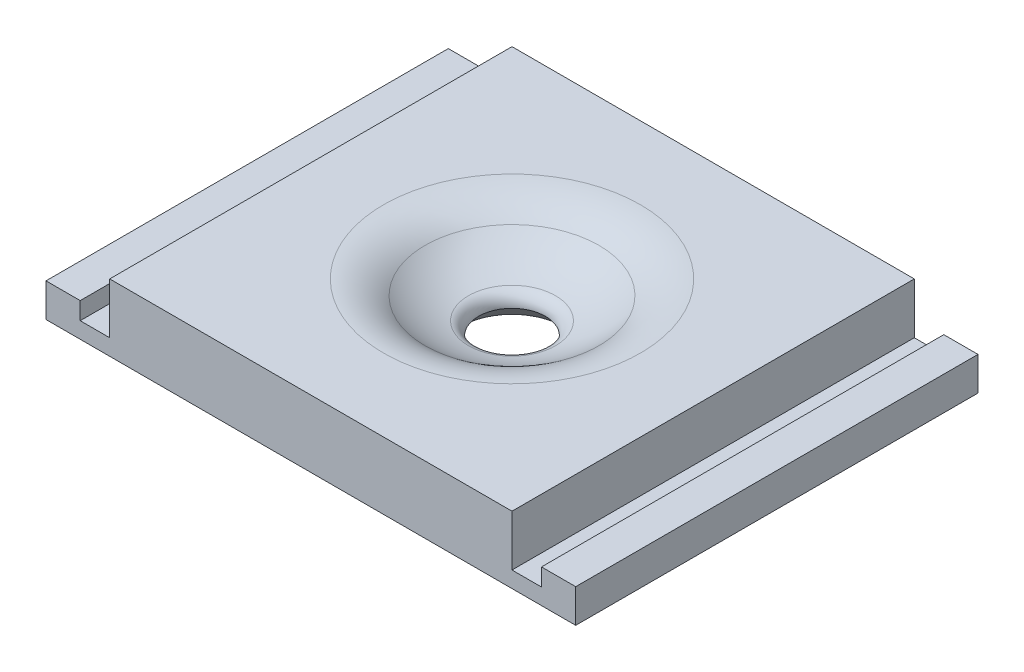
ISO-10303-21;
HEADER;
FILE_DESCRIPTION(('STEP AP214'),'2;1');
FILE_NAME('part.step','',(''),(''),'','','');
FILE_SCHEMA(('AUTOMOTIVE_DESIGN { 1 0 10303 214 1 1 1 1 }'));
ENDSEC;
DATA;
#1=APPLICATION_CONTEXT('core data for automotive mechanical design processes');
#2=APPLICATION_PROTOCOL_DEFINITION('international standard','automotive_design',2000,#1);
#3=PRODUCT_CONTEXT('',#1,'mechanical');
#4=PRODUCT('Part','Part','',(#3));
#5=PRODUCT_RELATED_PRODUCT_CATEGORY('part','',(#4));
#6=PRODUCT_DEFINITION_FORMATION('','',#4);
#7=PRODUCT_DEFINITION_CONTEXT('part definition',#1,'design');
#8=PRODUCT_DEFINITION('design','',#6,#7);
#9=PRODUCT_DEFINITION_SHAPE('','',#8);
#10=(LENGTH_UNIT() NAMED_UNIT(*) SI_UNIT(.MILLI.,.METRE.));
#11=(NAMED_UNIT(*) PLANE_ANGLE_UNIT() SI_UNIT($,.RADIAN.));
#12=(NAMED_UNIT(*) SI_UNIT($,.STERADIAN.) SOLID_ANGLE_UNIT());
#13=UNCERTAINTY_MEASURE_WITH_UNIT(LENGTH_MEASURE(1.E-05),#10,'distance_accuracy_value','');
#14=(GEOMETRIC_REPRESENTATION_CONTEXT(3) GLOBAL_UNCERTAINTY_ASSIGNED_CONTEXT((#13)) GLOBAL_UNIT_ASSIGNED_CONTEXT((#10,
#11,#12)) REPRESENTATION_CONTEXT('',''));
#15=CARTESIAN_POINT('',(0.,0.,0.));
#16=DIRECTION('',(0.,0.,1.));
#17=DIRECTION('',(1.,0.,0.));
#18=AXIS2_PLACEMENT_3D('',#15,#16,#17);
#19=CARTESIAN_POINT('',(-15.,11.,15.));
#20=DIRECTION('',(1.,0.,0.));
#21=DIRECTION('',(0.,0.,-1.));
#22=AXIS2_PLACEMENT_3D('',#19,#20,#21);
#23=PLANE('',#22);
#24=DIRECTION('',(0.,0.,-1.));
#25=VECTOR('',#24,1.);
#26=CARTESIAN_POINT('',(-15.,7.2,15.));
#27=LINE('',#26,#25);
#28=CARTESIAN_POINT('',(-15.,7.2,15.));
#29=VERTEX_POINT('',#28);
#30=CARTESIAN_POINT('',(-15.,7.2,-15.));
#31=VERTEX_POINT('',#30);
#32=EDGE_CURVE('E166',#29,#31,#27,.T.);
#33=ORIENTED_EDGE('',*,*,#32,.F.);
#34=DIRECTION('',(0.,-1.,0.));
#35=VECTOR('',#34,1.);
#36=CARTESIAN_POINT('',(-15.,11.,15.));
#37=LINE('',#36,#35);
#38=CARTESIAN_POINT('',(-15.,11.,15.));
#39=VERTEX_POINT('',#38);
#40=EDGE_CURVE('E215',#39,#29,#37,.T.);
#41=ORIENTED_EDGE('',*,*,#40,.F.);
#42=DIRECTION('',(0.,0.,1.));
#43=VECTOR('',#42,1.);
#44=CARTESIAN_POINT('',(-15.,11.,15.));
#45=LINE('',#44,#43);
#46=CARTESIAN_POINT('',(-15.,11.,-15.));
#47=VERTEX_POINT('',#46);
#48=EDGE_CURVE('E208',#47,#39,#45,.T.);
#49=ORIENTED_EDGE('',*,*,#48,.F.);
#50=DIRECTION('',(0.,-1.,0.));
#51=VECTOR('',#50,1.);
#52=CARTESIAN_POINT('',(-15.,11.,-15.));
#53=LINE('',#52,#51);
#54=EDGE_CURVE('E218',#47,#31,#53,.T.);
#55=ORIENTED_EDGE('',*,*,#54,.T.);
#56=EDGE_LOOP('',(#33,#41,#49,#55));
#57=FACE_BOUND('',#56,.T.);
#58=ADVANCED_FACE('F39',(#57),#23,.F.);
#59=CARTESIAN_POINT('',(15.,11.,15.));
#60=DIRECTION('',(-1.,0.,0.));
#61=DIRECTION('',(0.,0.,1.));
#62=AXIS2_PLACEMENT_3D('',#59,#60,#61);
#63=PLANE('',#62);
#64=DIRECTION('',(0.,-1.,0.));
#65=VECTOR('',#64,1.);
#66=CARTESIAN_POINT('',(15.,11.,15.));
#67=LINE('',#66,#65);
#68=CARTESIAN_POINT('',(15.,11.,15.));
#69=VERTEX_POINT('',#68);
#70=CARTESIAN_POINT('',(15.,7.2,15.));
#71=VERTEX_POINT('',#70);
#72=EDGE_CURVE('E212',#69,#71,#67,.T.);
#73=ORIENTED_EDGE('',*,*,#72,.T.);
#74=DIRECTION('',(0.,0.,-1.));
#75=VECTOR('',#74,1.);
#76=CARTESIAN_POINT('',(15.,7.2,15.));
#77=LINE('',#76,#75);
#78=CARTESIAN_POINT('',(15.,7.2,-15.));
#79=VERTEX_POINT('',#78);
#80=EDGE_CURVE('E188',#71,#79,#77,.T.);
#81=ORIENTED_EDGE('',*,*,#80,.T.);
#82=DIRECTION('',(0.,-1.,0.));
#83=VECTOR('',#82,1.);
#84=CARTESIAN_POINT('',(15.,11.,-15.));
#85=LINE('',#84,#83);
#86=CARTESIAN_POINT('',(15.,11.,-15.));
#87=VERTEX_POINT('',#86);
#88=EDGE_CURVE('E135',#87,#79,#85,.T.);
#89=ORIENTED_EDGE('',*,*,#88,.F.);
#90=DIRECTION('',(0.,0.,-1.));
#91=VECTOR('',#90,1.);
#92=CARTESIAN_POINT('',(15.,11.,15.));
#93=LINE('',#92,#91);
#94=EDGE_CURVE('E198',#69,#87,#93,.T.);
#95=ORIENTED_EDGE('',*,*,#94,.F.);
#96=EDGE_LOOP('',(#73,#81,#89,#95));
#97=FACE_BOUND('',#96,.T.);
#98=ADVANCED_FACE('F245',(#97),#63,.F.);
#99=CARTESIAN_POINT('',(-15.,11.,-15.));
#100=DIRECTION('',(0.,0.,1.));
#101=DIRECTION('',(1.,0.,0.));
#102=AXIS2_PLACEMENT_3D('',#99,#100,#101);
#103=PLANE('',#102);
#104=DIRECTION('',(0.,-1.,0.));
#105=VECTOR('',#104,1.);
#106=CARTESIAN_POINT('',(19.75,8.5,-15.));
#107=LINE('',#106,#105);
#108=CARTESIAN_POINT('',(19.75,8.5,-15.));
#109=VERTEX_POINT('',#108);
#110=CARTESIAN_POINT('',(19.75,6.,-15.));
#111=VERTEX_POINT('',#110);
#112=EDGE_CURVE('E145',#109,#111,#107,.T.);
#113=ORIENTED_EDGE('',*,*,#112,.T.);
#114=DIRECTION('',(1.,0.,0.));
#115=VECTOR('',#114,1.);
#116=CARTESIAN_POINT('',(22.9497671894651,6.,-15.));
#117=LINE('',#116,#115);
#118=CARTESIAN_POINT('',(-19.75,6.,-15.));
#119=VERTEX_POINT('',#118);
#120=EDGE_CURVE('E128',#119,#111,#117,.T.);
#121=ORIENTED_EDGE('',*,*,#120,.F.);
#122=DIRECTION('',(0.,-1.,0.));
#123=VECTOR('',#122,1.);
#124=CARTESIAN_POINT('',(-19.75,8.5,-15.));
#125=LINE('',#124,#123);
#126=CARTESIAN_POINT('',(-19.75,8.5,-15.));
#127=VERTEX_POINT('',#126);
#128=EDGE_CURVE('E142',#127,#119,#125,.T.);
#129=ORIENTED_EDGE('',*,*,#128,.F.);
#130=DIRECTION('',(-1.,0.,0.));
#131=VECTOR('',#130,1.);
#132=CARTESIAN_POINT('',(-17.2,8.5,-15.));
#133=LINE('',#132,#131);
#134=CARTESIAN_POINT('',(-17.2,8.5,-15.));
#135=VERTEX_POINT('',#134);
#136=EDGE_CURVE('E152',#135,#127,#133,.T.);
#137=ORIENTED_EDGE('',*,*,#136,.F.);
#138=DIRECTION('',(0.,1.,0.));
#139=VECTOR('',#138,1.);
#140=CARTESIAN_POINT('',(-17.2,7.2,-15.));
#141=LINE('',#140,#139);
#142=CARTESIAN_POINT('',(-17.2,7.2,-15.));
#143=VERTEX_POINT('',#142);
#144=EDGE_CURVE('E155',#143,#135,#141,.T.);
#145=ORIENTED_EDGE('',*,*,#144,.F.);
#146=DIRECTION('',(-1.,0.,0.));
#147=VECTOR('',#146,1.);
#148=CARTESIAN_POINT('',(-15.,7.2,-15.));
#149=LINE('',#148,#147);
#150=EDGE_CURVE('E163',#31,#143,#149,.T.);
#151=ORIENTED_EDGE('',*,*,#150,.F.);
#152=ORIENTED_EDGE('',*,*,#54,.F.);
#153=DIRECTION('',(-1.,0.,0.));
#154=VECTOR('',#153,1.);
#155=CARTESIAN_POINT('',(-15.,11.,-15.));
#156=LINE('',#155,#154);
#157=EDGE_CURVE('E206',#87,#47,#156,.T.);
#158=ORIENTED_EDGE('',*,*,#157,.F.);
#159=ORIENTED_EDGE('',*,*,#88,.T.);
#160=DIRECTION('',(1.,0.,0.));
#161=VECTOR('',#160,1.);
#162=CARTESIAN_POINT('',(15.,7.2,-15.));
#163=LINE('',#162,#161);
#164=CARTESIAN_POINT('',(17.2,7.2,-15.));
#165=VERTEX_POINT('',#164);
#166=EDGE_CURVE('E62',#79,#165,#163,.T.);
#167=ORIENTED_EDGE('',*,*,#166,.T.);
#168=DIRECTION('',(0.,1.,0.));
#169=VECTOR('',#168,1.);
#170=CARTESIAN_POINT('',(17.2,7.2,-15.));
#171=LINE('',#170,#169);
#172=CARTESIAN_POINT('',(17.2,8.5,-15.));
#173=VERTEX_POINT('',#172);
#174=EDGE_CURVE('E190',#165,#173,#171,.T.);
#175=ORIENTED_EDGE('',*,*,#174,.T.);
#176=DIRECTION('',(1.,0.,0.));
#177=VECTOR('',#176,1.);
#178=CARTESIAN_POINT('',(17.2,8.5,-15.));
#179=LINE('',#178,#177);
#180=EDGE_CURVE('E193',#173,#109,#179,.T.);
#181=ORIENTED_EDGE('',*,*,#180,.T.);
#182=EDGE_LOOP('',(#113,#121,#129,#137,#145,#151,#152,#158,#159,#167,#175,#181));
#183=FACE_BOUND('',#182,.T.);
#184=ADVANCED_FACE('F140',(#183),#103,.F.);
#185=CARTESIAN_POINT('',(-15.,11.,15.));
#186=DIRECTION('',(0.,0.,-1.));
#187=DIRECTION('',(-1.,0.,0.));
#188=AXIS2_PLACEMENT_3D('',#185,#186,#187);
#189=PLANE('',#188);
#190=DIRECTION('',(0.,-1.,0.));
#191=VECTOR('',#190,1.);
#192=CARTESIAN_POINT('',(-19.75,8.5,15.));
#193=LINE('',#192,#191);
#194=CARTESIAN_POINT('',(-19.75,8.5,15.));
#195=VERTEX_POINT('',#194);
#196=CARTESIAN_POINT('',(-19.75,6.,15.));
#197=VERTEX_POINT('',#196);
#198=EDGE_CURVE('E165',#195,#197,#193,.T.);
#199=ORIENTED_EDGE('',*,*,#198,.T.);
#200=DIRECTION('',(1.,0.,0.));
#201=VECTOR('',#200,1.);
#202=CARTESIAN_POINT('',(-15.,6.,15.));
#203=LINE('',#202,#201);
#204=CARTESIAN_POINT('',(19.75,6.,15.));
#205=VERTEX_POINT('',#204);
#206=EDGE_CURVE('E54',#197,#205,#203,.T.);
#207=ORIENTED_EDGE('',*,*,#206,.T.);
#208=DIRECTION('',(0.,-1.,0.));
#209=VECTOR('',#208,1.);
#210=CARTESIAN_POINT('',(19.75,8.5,15.));
#211=LINE('',#210,#209);
#212=CARTESIAN_POINT('',(19.75,8.5,15.));
#213=VERTEX_POINT('',#212);
#214=EDGE_CURVE('E185',#213,#205,#211,.T.);
#215=ORIENTED_EDGE('',*,*,#214,.F.);
#216=DIRECTION('',(1.,0.,0.));
#217=VECTOR('',#216,1.);
#218=CARTESIAN_POINT('',(17.2,8.5,15.));
#219=LINE('',#218,#217);
#220=CARTESIAN_POINT('',(17.2,8.5,15.));
#221=VERTEX_POINT('',#220);
#222=EDGE_CURVE('E182',#221,#213,#219,.T.);
#223=ORIENTED_EDGE('',*,*,#222,.F.);
#224=DIRECTION('',(0.,1.,0.));
#225=VECTOR('',#224,1.);
#226=CARTESIAN_POINT('',(17.2,7.2,15.));
#227=LINE('',#226,#225);
#228=CARTESIAN_POINT('',(17.2,7.2,15.));
#229=VERTEX_POINT('',#228);
#230=EDGE_CURVE('E179',#229,#221,#227,.T.);
#231=ORIENTED_EDGE('',*,*,#230,.F.);
#232=DIRECTION('',(1.,0.,0.));
#233=VECTOR('',#232,1.);
#234=CARTESIAN_POINT('',(15.,7.2,15.));
#235=LINE('',#234,#233);
#236=EDGE_CURVE('E176',#71,#229,#235,.T.);
#237=ORIENTED_EDGE('',*,*,#236,.F.);
#238=ORIENTED_EDGE('',*,*,#72,.F.);
#239=DIRECTION('',(1.,0.,0.));
#240=VECTOR('',#239,1.);
#241=CARTESIAN_POINT('',(-15.,11.,15.));
#242=LINE('',#241,#240);
#243=EDGE_CURVE('E210',#39,#69,#242,.T.);
#244=ORIENTED_EDGE('',*,*,#243,.F.);
#245=ORIENTED_EDGE('',*,*,#40,.T.);
#246=DIRECTION('',(-1.,0.,0.));
#247=VECTOR('',#246,1.);
#248=CARTESIAN_POINT('',(-15.,7.2,15.));
#249=LINE('',#248,#247);
#250=CARTESIAN_POINT('',(-17.2,7.2,15.));
#251=VERTEX_POINT('',#250);
#252=EDGE_CURVE('E159',#29,#251,#249,.T.);
#253=ORIENTED_EDGE('',*,*,#252,.T.);
#254=DIRECTION('',(0.,1.,0.));
#255=VECTOR('',#254,1.);
#256=CARTESIAN_POINT('',(-17.2,7.2,15.));
#257=LINE('',#256,#255);
#258=CARTESIAN_POINT('',(-17.2,8.5,15.));
#259=VERTEX_POINT('',#258);
#260=EDGE_CURVE('E270',#251,#259,#257,.T.);
#261=ORIENTED_EDGE('',*,*,#260,.T.);
#262=DIRECTION('',(-1.,0.,0.));
#263=VECTOR('',#262,1.);
#264=CARTESIAN_POINT('',(-17.2,8.5,15.));
#265=LINE('',#264,#263);
#266=EDGE_CURVE('E269',#259,#195,#265,.T.);
#267=ORIENTED_EDGE('',*,*,#266,.T.);
#268=EDGE_LOOP('',(#199,#207,#215,#223,#231,#237,#238,#244,#245,#253,#261,#267));
#269=FACE_BOUND('',#268,.T.);
#270=ADVANCED_FACE('F237',(#269),#189,.F.);
#271=CARTESIAN_POINT('',(0.,11.,0.));
#272=DIRECTION('',(0.,-1.,0.));
#273=DIRECTION('',(0.,0.,-1.));
#274=AXIS2_PLACEMENT_3D('',#271,#272,#273);
#275=PLANE('',#274);
#276=CARTESIAN_POINT('',(0.,11.,0.));
#277=DIRECTION('',(0.,-1.,0.));
#278=DIRECTION('',(0.,0.,-1.));
#279=AXIS2_PLACEMENT_3D('',#276,#277,#278);
#280=CIRCLE('',#279,9.58098125255367);
#281=CARTESIAN_POINT('',(0.,11.,-9.58098125255367));
#282=VERTEX_POINT('',#281);
#283=EDGE_CURVE('E134',#282,#282,#280,.T.);
#284=ORIENTED_EDGE('',*,*,#283,.T.);
#285=EDGE_LOOP('',(#284));
#286=FACE_BOUND('',#285,.T.);
#287=ORIENTED_EDGE('',*,*,#94,.T.);
#288=ORIENTED_EDGE('',*,*,#157,.T.);
#289=ORIENTED_EDGE('',*,*,#48,.T.);
#290=ORIENTED_EDGE('',*,*,#243,.T.);
#291=EDGE_LOOP('',(#287,#288,#289,#290));
#292=FACE_BOUND('',#291,.T.);
#293=ADVANCED_FACE('F234',(#286,#292),#275,.F.);
#294=CARTESIAN_POINT('',(0.,6.,0.));
#295=DIRECTION('',(0.,-1.,0.));
#296=DIRECTION('',(0.,0.,-1.));
#297=AXIS2_PLACEMENT_3D('',#294,#295,#296);
#298=PLANE('',#297);
#299=CARTESIAN_POINT('',(0.,6.,0.));
#300=DIRECTION('',(0.,1.,0.));
#301=DIRECTION('',(0.,0.,1.));
#302=AXIS2_PLACEMENT_3D('',#299,#300,#301);
#303=CIRCLE('',#302,3.83277281543894);
#304=CARTESIAN_POINT('',(0.,6.,3.83277281543894));
#305=VERTEX_POINT('',#304);
#306=EDGE_CURVE('E146',#305,#305,#303,.T.);
#307=ORIENTED_EDGE('',*,*,#306,.T.);
#308=EDGE_LOOP('',(#307));
#309=FACE_BOUND('',#308,.T.);
#310=DIRECTION('',(0.,0.,1.));
#311=VECTOR('',#310,1.);
#312=CARTESIAN_POINT('',(19.75,6.,15.));
#313=LINE('',#312,#311);
#314=EDGE_CURVE('E153',#111,#205,#313,.T.);
#315=ORIENTED_EDGE('',*,*,#314,.T.);
#316=ORIENTED_EDGE('',*,*,#206,.F.);
#317=DIRECTION('',(0.,0.,1.));
#318=VECTOR('',#317,1.);
#319=CARTESIAN_POINT('',(-19.75,6.,15.));
#320=LINE('',#319,#318);
#321=EDGE_CURVE('E125',#119,#197,#320,.T.);
#322=ORIENTED_EDGE('',*,*,#321,.F.);
#323=ORIENTED_EDGE('',*,*,#120,.T.);
#324=EDGE_LOOP('',(#315,#316,#322,#323));
#325=FACE_BOUND('',#324,.T.);
#326=ADVANCED_FACE('F127',(#309,#325),#298,.T.);
#327=CARTESIAN_POINT('',(19.75,8.5,15.));
#328=DIRECTION('',(1.,0.,0.));
#329=DIRECTION('',(0.,0.,-1.));
#330=AXIS2_PLACEMENT_3D('',#327,#328,#329);
#331=PLANE('',#330);
#332=ORIENTED_EDGE('',*,*,#314,.F.);
#333=ORIENTED_EDGE('',*,*,#112,.F.);
#334=DIRECTION('',(0.,0.,-1.));
#335=VECTOR('',#334,1.);
#336=CARTESIAN_POINT('',(19.75,8.5,15.));
#337=LINE('',#336,#335);
#338=EDGE_CURVE('E196',#213,#109,#337,.T.);
#339=ORIENTED_EDGE('',*,*,#338,.F.);
#340=ORIENTED_EDGE('',*,*,#214,.T.);
#341=EDGE_LOOP('',(#332,#333,#339,#340));
#342=FACE_BOUND('',#341,.T.);
#343=ADVANCED_FACE('F264',(#342),#331,.T.);
#344=CARTESIAN_POINT('',(17.2,8.5,15.));
#345=DIRECTION('',(0.,1.,0.));
#346=DIRECTION('',(0.,0.,1.));
#347=AXIS2_PLACEMENT_3D('',#344,#345,#346);
#348=PLANE('',#347);
#349=ORIENTED_EDGE('',*,*,#180,.F.);
#350=DIRECTION('',(0.,0.,-1.));
#351=VECTOR('',#350,1.);
#352=CARTESIAN_POINT('',(17.2,8.5,15.));
#353=LINE('',#352,#351);
#354=EDGE_CURVE('E199',#221,#173,#353,.T.);
#355=ORIENTED_EDGE('',*,*,#354,.F.);
#356=ORIENTED_EDGE('',*,*,#222,.T.);
#357=ORIENTED_EDGE('',*,*,#338,.T.);
#358=EDGE_LOOP('',(#349,#355,#356,#357));
#359=FACE_BOUND('',#358,.T.);
#360=ADVANCED_FACE('F261',(#359),#348,.T.);
#361=CARTESIAN_POINT('',(17.2,7.2,15.));
#362=DIRECTION('',(-1.,0.,0.));
#363=DIRECTION('',(0.,0.,1.));
#364=AXIS2_PLACEMENT_3D('',#361,#362,#363);
#365=PLANE('',#364);
#366=ORIENTED_EDGE('',*,*,#174,.F.);
#367=DIRECTION('',(0.,0.,-1.));
#368=VECTOR('',#367,1.);
#369=CARTESIAN_POINT('',(17.2,7.2,15.));
#370=LINE('',#369,#368);
#371=EDGE_CURVE('E201',#229,#165,#370,.T.);
#372=ORIENTED_EDGE('',*,*,#371,.F.);
#373=ORIENTED_EDGE('',*,*,#230,.T.);
#374=ORIENTED_EDGE('',*,*,#354,.T.);
#375=EDGE_LOOP('',(#366,#372,#373,#374));
#376=FACE_BOUND('',#375,.T.);
#377=ADVANCED_FACE('F258',(#376),#365,.T.);
#378=CARTESIAN_POINT('',(15.,7.2,15.));
#379=DIRECTION('',(0.,1.,0.));
#380=DIRECTION('',(0.,0.,1.));
#381=AXIS2_PLACEMENT_3D('',#378,#379,#380);
#382=PLANE('',#381);
#383=ORIENTED_EDGE('',*,*,#166,.F.);
#384=ORIENTED_EDGE('',*,*,#80,.F.);
#385=ORIENTED_EDGE('',*,*,#236,.T.);
#386=ORIENTED_EDGE('',*,*,#371,.T.);
#387=EDGE_LOOP('',(#383,#384,#385,#386));
#388=FACE_BOUND('',#387,.T.);
#389=ADVANCED_FACE('F255',(#388),#382,.T.);
#390=CARTESIAN_POINT('',(-15.,7.2,15.));
#391=DIRECTION('',(0.,-1.,0.));
#392=DIRECTION('',(0.,0.,-1.));
#393=AXIS2_PLACEMENT_3D('',#390,#391,#392);
#394=PLANE('',#393);
#395=ORIENTED_EDGE('',*,*,#150,.T.);
#396=DIRECTION('',(0.,0.,-1.));
#397=VECTOR('',#396,1.);
#398=CARTESIAN_POINT('',(-17.2,7.2,15.));
#399=LINE('',#398,#397);
#400=EDGE_CURVE('E169',#251,#143,#399,.T.);
#401=ORIENTED_EDGE('',*,*,#400,.F.);
#402=ORIENTED_EDGE('',*,*,#252,.F.);
#403=ORIENTED_EDGE('',*,*,#32,.T.);
#404=EDGE_LOOP('',(#395,#401,#402,#403));
#405=FACE_BOUND('',#404,.T.);
#406=ADVANCED_FACE('F275',(#405),#394,.F.);
#407=CARTESIAN_POINT('',(-17.2,7.2,15.));
#408=DIRECTION('',(-1.,0.,0.));
#409=DIRECTION('',(0.,0.,1.));
#410=AXIS2_PLACEMENT_3D('',#407,#408,#409);
#411=PLANE('',#410);
#412=ORIENTED_EDGE('',*,*,#144,.T.);
#413=DIRECTION('',(0.,0.,-1.));
#414=VECTOR('',#413,1.);
#415=CARTESIAN_POINT('',(-17.2,8.5,15.));
#416=LINE('',#415,#414);
#417=EDGE_CURVE('E172',#259,#135,#416,.T.);
#418=ORIENTED_EDGE('',*,*,#417,.F.);
#419=ORIENTED_EDGE('',*,*,#260,.F.);
#420=ORIENTED_EDGE('',*,*,#400,.T.);
#421=EDGE_LOOP('',(#412,#418,#419,#420));
#422=FACE_BOUND('',#421,.T.);
#423=ADVANCED_FACE('F277',(#422),#411,.F.);
#424=CARTESIAN_POINT('',(-17.2,8.5,15.));
#425=DIRECTION('',(0.,-1.,0.));
#426=DIRECTION('',(0.,0.,-1.));
#427=AXIS2_PLACEMENT_3D('',#424,#425,#426);
#428=PLANE('',#427);
#429=ORIENTED_EDGE('',*,*,#136,.T.);
#430=DIRECTION('',(0.,0.,-1.));
#431=VECTOR('',#430,1.);
#432=CARTESIAN_POINT('',(-19.75,8.5,15.));
#433=LINE('',#432,#431);
#434=EDGE_CURVE('E151',#195,#127,#433,.T.);
#435=ORIENTED_EDGE('',*,*,#434,.F.);
#436=ORIENTED_EDGE('',*,*,#266,.F.);
#437=ORIENTED_EDGE('',*,*,#417,.T.);
#438=EDGE_LOOP('',(#429,#435,#436,#437));
#439=FACE_BOUND('',#438,.T.);
#440=ADVANCED_FACE('F280',(#439),#428,.F.);
#441=CARTESIAN_POINT('',(-19.75,8.5,15.));
#442=DIRECTION('',(1.,0.,0.));
#443=DIRECTION('',(0.,0.,-1.));
#444=AXIS2_PLACEMENT_3D('',#441,#442,#443);
#445=PLANE('',#444);
#446=ORIENTED_EDGE('',*,*,#128,.T.);
#447=ORIENTED_EDGE('',*,*,#321,.T.);
#448=ORIENTED_EDGE('',*,*,#198,.F.);
#449=ORIENTED_EDGE('',*,*,#434,.T.);
#450=EDGE_LOOP('',(#446,#447,#448,#449));
#451=FACE_BOUND('',#450,.T.);
#452=ADVANCED_FACE('F149',(#451),#445,.F.);
#453=CARTESIAN_POINT('',(0.,16.9915460294657,0.));
#454=DIRECTION('',(0.,1.,0.));
#455=DIRECTION('',(0.,0.,1.));
#456=AXIS2_PLACEMENT_3D('',#453,#454,#455);
#457=DEGENERATE_TOROIDAL_SURFACE('',#456,0.91,9.,.T.);
#458=CARTESIAN_POINT('',(0.,8.29865013684163,0.));
#459=DIRECTION('',(0.,1.,0.));
#460=DIRECTION('',(0.,0.,1.));
#461=AXIS2_PLACEMENT_3D('',#458,#459,#460);
#462=CIRCLE('',#461,3.241);
#463=CARTESIAN_POINT('',(0.,8.29865013684163,3.241));
#464=VERTEX_POINT('',#463);
#465=EDGE_CURVE('E11',#464,#464,#462,.F.);
#466=ORIENTED_EDGE('',*,*,#465,.T.);
#467=EDGE_LOOP('',(#466));
#468=FACE_BOUND('',#467,.T.);
#469=CARTESIAN_POINT('',(0.,9.9255521533806,0.));
#470=DIRECTION('',(0.,1.,0.));
#471=DIRECTION('',(0.,0.,1.));
#472=AXIS2_PLACEMENT_3D('',#469,#470,#471);
#473=CIRCLE('',#472,6.4842022337845);
#474=CARTESIAN_POINT('',(0.,9.9255521533806,6.4842022337845));
#475=VERTEX_POINT('',#474);
#476=EDGE_CURVE('E47',#475,#475,#473,.T.);
#477=ORIENTED_EDGE('',*,*,#476,.T.);
#478=EDGE_LOOP('',(#477));
#479=FACE_BOUND('',#478,.T.);
#480=ADVANCED_FACE('F227',(#468,#479),#457,.F.);
#481=CARTESIAN_POINT('',(0.,6.,0.));
#482=DIRECTION('',(0.,-1.,0.));
#483=DIRECTION('',(0.,0.,-1.));
#484=AXIS2_PLACEMENT_3D('',#481,#482,#483);
#485=TOROIDAL_SURFACE('',#484,9.58098125255367,5.);
#486=ORIENTED_EDGE('',*,*,#476,.F.);
#487=EDGE_LOOP('',(#486));
#488=FACE_BOUND('',#487,.T.);
#489=ORIENTED_EDGE('',*,*,#283,.F.);
#490=EDGE_LOOP('',(#489));
#491=FACE_BOUND('',#490,.T.);
#492=ADVANCED_FACE('F229',(#488,#491),#485,.T.);
#493=CARTESIAN_POINT('',(0.,7.33277281543896,0.));
#494=DIRECTION('',(0.,-1.,0.));
#495=DIRECTION('',(0.,0.,-1.));
#496=AXIS2_PLACEMENT_3D('',#493,#494,#495);
#497=TOROIDAL_SURFACE('',#496,3.5,1.);
#498=ORIENTED_EDGE('',*,*,#465,.F.);
#499=EDGE_LOOP('',(#498));
#500=FACE_BOUND('',#499,.T.);
#501=CARTESIAN_POINT('',(0.,7.33277281543896,0.));
#502=DIRECTION('',(0.,1.,0.));
#503=DIRECTION('',(0.,0.,1.));
#504=AXIS2_PLACEMENT_3D('',#501,#502,#503);
#505=CIRCLE('',#504,2.5);
#506=CARTESIAN_POINT('',(0.,7.33277281543896,2.5));
#507=VERTEX_POINT('',#506);
#508=EDGE_CURVE('E454',#507,#507,#505,.T.);
#509=ORIENTED_EDGE('',*,*,#508,.F.);
#510=EDGE_LOOP('',(#509));
#511=FACE_BOUND('',#510,.T.);
#512=ADVANCED_FACE('F41',(#500,#511),#497,.T.);
#513=CARTESIAN_POINT('',(0.,7.33277281543896,0.));
#514=DIRECTION('',(0.,-1.,0.));
#515=DIRECTION('',(0.,0.,-1.));
#516=AXIS2_PLACEMENT_3D('',#513,#514,#515);
#517=CONICAL_SURFACE('',#516,2.5,0.78539816339744);
#518=ORIENTED_EDGE('',*,*,#306,.F.);
#519=EDGE_LOOP('',(#518));
#520=FACE_BOUND('',#519,.T.);
#521=ORIENTED_EDGE('',*,*,#508,.T.);
#522=EDGE_LOOP('',(#521));
#523=FACE_BOUND('',#522,.T.);
#524=ADVANCED_FACE('F348',(#520,#523),#517,.F.);
#525=CLOSED_SHELL('',(#58,#98,#184,#270,#293,#326,#343,#360,#377,#389,#406,#423,#440,#452,#480,
#492,#512,#524));
#526=MANIFOLD_SOLID_BREP('B2',#525);
#527=ADVANCED_BREP_SHAPE_REPRESENTATION('',(#18,#526),#14);
#528=SHAPE_DEFINITION_REPRESENTATION(#9,#527);
ENDSEC;
END-ISO-10303-21;
